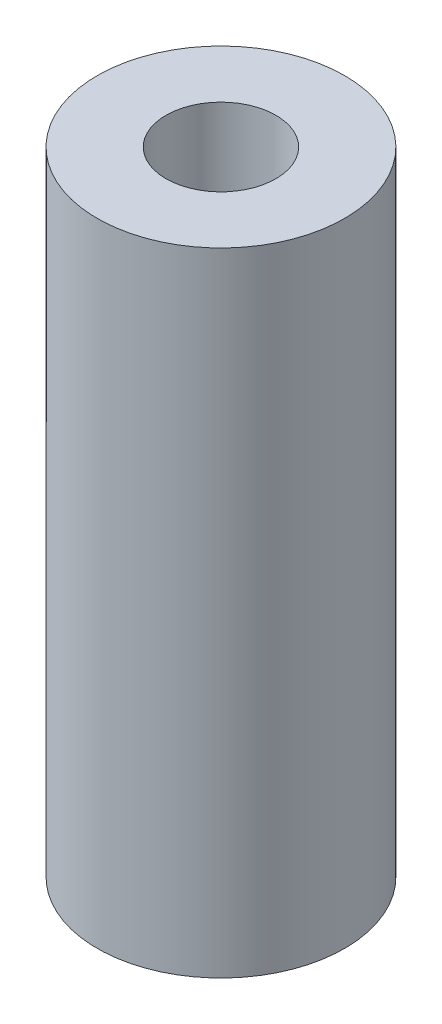
ISO-10303-21;
HEADER;
FILE_DESCRIPTION(('STEP AP214'),'2;1');
FILE_NAME('part.step','',(''),(''),'','','');
FILE_SCHEMA(('AUTOMOTIVE_DESIGN { 1 0 10303 214 1 1 1 1 }'));
ENDSEC;
DATA;
#1=APPLICATION_CONTEXT('core data for automotive mechanical design processes');
#2=APPLICATION_PROTOCOL_DEFINITION('international standard','automotive_design',2000,#1);
#3=PRODUCT_CONTEXT('',#1,'mechanical');
#4=PRODUCT('Part','Part','',(#3));
#5=PRODUCT_RELATED_PRODUCT_CATEGORY('part','',(#4));
#6=PRODUCT_DEFINITION_FORMATION('','',#4);
#7=PRODUCT_DEFINITION_CONTEXT('part definition',#1,'design');
#8=PRODUCT_DEFINITION('design','',#6,#7);
#9=PRODUCT_DEFINITION_SHAPE('','',#8);
#10=(LENGTH_UNIT() NAMED_UNIT(*) SI_UNIT(.MILLI.,.METRE.));
#11=(NAMED_UNIT(*) PLANE_ANGLE_UNIT() SI_UNIT($,.RADIAN.));
#12=(NAMED_UNIT(*) SI_UNIT($,.STERADIAN.) SOLID_ANGLE_UNIT());
#13=UNCERTAINTY_MEASURE_WITH_UNIT(LENGTH_MEASURE(1.E-05),#10,'distance_accuracy_value','');
#14=(GEOMETRIC_REPRESENTATION_CONTEXT(3) GLOBAL_UNCERTAINTY_ASSIGNED_CONTEXT((#13)) GLOBAL_UNIT_ASSIGNED_CONTEXT((#10,
#11,#12)) REPRESENTATION_CONTEXT('',''));
#15=CARTESIAN_POINT('',(0.,0.,0.));
#16=DIRECTION('',(0.,0.,1.));
#17=DIRECTION('',(1.,0.,0.));
#18=AXIS2_PLACEMENT_3D('',#15,#16,#17);
#19=CARTESIAN_POINT('',(0.,0.,0.));
#20=DIRECTION('',(0.,1.,0.));
#21=DIRECTION('',(0.,0.,1.));
#22=AXIS2_PLACEMENT_3D('',#19,#20,#21);
#23=PLANE('',#22);
#24=CARTESIAN_POINT('',(0.,0.,0.));
#25=DIRECTION('',(0.,-1.,0.));
#26=DIRECTION('',(0.,0.,-1.));
#27=AXIS2_PLACEMENT_3D('',#24,#25,#26);
#28=CIRCLE('',#27,1.5);
#29=CARTESIAN_POINT('',(0.,0.,-1.5));
#30=VERTEX_POINT('',#29);
#31=EDGE_CURVE('E43',#30,#30,#28,.T.);
#32=ORIENTED_EDGE('',*,*,#31,.F.);
#33=EDGE_LOOP('',(#32));
#34=FACE_BOUND('',#33,.T.);
#35=CARTESIAN_POINT('',(0.,0.,0.));
#36=DIRECTION('',(0.,-1.,0.));
#37=DIRECTION('',(0.,0.,-1.));
#38=AXIS2_PLACEMENT_3D('',#35,#36,#37);
#39=CIRCLE('',#38,4.5);
#40=CARTESIAN_POINT('',(0.,0.,-4.5));
#41=VERTEX_POINT('',#40);
#42=EDGE_CURVE('E34',#41,#41,#39,.T.);
#43=ORIENTED_EDGE('',*,*,#42,.T.);
#44=EDGE_LOOP('',(#43));
#45=FACE_BOUND('',#44,.T.);
#46=ADVANCED_FACE('F31',(#34,#45),#23,.F.);
#47=CARTESIAN_POINT('',(0.,23.,0.));
#48=DIRECTION('',(0.,-1.,0.));
#49=DIRECTION('',(0.,0.,-1.));
#50=AXIS2_PLACEMENT_3D('',#47,#48,#49);
#51=CYLINDRICAL_SURFACE('',#50,4.5);
#52=CARTESIAN_POINT('',(0.,23.,0.));
#53=DIRECTION('',(0.,-1.,0.));
#54=DIRECTION('',(0.,0.,-1.));
#55=AXIS2_PLACEMENT_3D('',#52,#53,#54);
#56=CIRCLE('',#55,4.5);
#57=CARTESIAN_POINT('',(0.,23.,-4.5));
#58=VERTEX_POINT('',#57);
#59=EDGE_CURVE('E10',#58,#58,#56,.T.);
#60=ORIENTED_EDGE('',*,*,#59,.T.);
#61=EDGE_LOOP('',(#60));
#62=FACE_BOUND('',#61,.T.);
#63=ORIENTED_EDGE('',*,*,#42,.F.);
#64=EDGE_LOOP('',(#63));
#65=FACE_BOUND('',#64,.T.);
#66=ADVANCED_FACE('F68',(#62,#65),#51,.T.);
#67=CARTESIAN_POINT('',(0.,23.,0.));
#68=DIRECTION('',(0.,1.,0.));
#69=DIRECTION('',(0.,0.,1.));
#70=AXIS2_PLACEMENT_3D('',#67,#68,#69);
#71=PLANE('',#70);
#72=CARTESIAN_POINT('',(0.,23.,0.));
#73=DIRECTION('',(0.,1.,0.));
#74=DIRECTION('',(0.,0.,1.));
#75=AXIS2_PLACEMENT_3D('',#72,#73,#74);
#76=CIRCLE('',#75,2.);
#77=CARTESIAN_POINT('',(0.,23.,2.));
#78=VERTEX_POINT('',#77);
#79=EDGE_CURVE('E49',#78,#78,#76,.T.);
#80=ORIENTED_EDGE('',*,*,#79,.F.);
#81=EDGE_LOOP('',(#80));
#82=FACE_BOUND('',#81,.T.);
#83=ORIENTED_EDGE('',*,*,#59,.F.);
#84=EDGE_LOOP('',(#83));
#85=FACE_BOUND('',#84,.T.);
#86=ADVANCED_FACE('F64',(#82,#85),#71,.T.);
#87=CARTESIAN_POINT('',(0.,5.,0.));
#88=DIRECTION('',(0.,-1.,0.));
#89=DIRECTION('',(0.,0.,-1.));
#90=AXIS2_PLACEMENT_3D('',#87,#88,#89);
#91=CYLINDRICAL_SURFACE('',#90,1.5);
#92=CARTESIAN_POINT('',(0.,5.,0.));
#93=DIRECTION('',(0.,-1.,0.));
#94=DIRECTION('',(0.,0.,-1.));
#95=AXIS2_PLACEMENT_3D('',#92,#93,#94);
#96=CIRCLE('',#95,1.5);
#97=CARTESIAN_POINT('',(0.,5.,-1.5));
#98=VERTEX_POINT('',#97);
#99=EDGE_CURVE('E41',#98,#98,#96,.T.);
#100=ORIENTED_EDGE('',*,*,#99,.F.);
#101=EDGE_LOOP('',(#100));
#102=FACE_BOUND('',#101,.T.);
#103=ORIENTED_EDGE('',*,*,#31,.T.);
#104=EDGE_LOOP('',(#103));
#105=FACE_BOUND('',#104,.T.);
#106=ADVANCED_FACE('F67',(#102,#105),#91,.F.);
#107=CARTESIAN_POINT('',(0.,5.,0.));
#108=DIRECTION('',(0.,-1.,0.));
#109=DIRECTION('',(0.,0.,-1.));
#110=AXIS2_PLACEMENT_3D('',#107,#108,#109);
#111=PLANE('',#110);
#112=ORIENTED_EDGE('',*,*,#99,.T.);
#113=EDGE_LOOP('',(#112));
#114=FACE_BOUND('',#113,.T.);
#115=ADVANCED_FACE('F60',(#114),#111,.T.);
#116=CARTESIAN_POINT('',(0.,18.,0.));
#117=DIRECTION('',(0.,1.,0.));
#118=DIRECTION('',(0.,0.,1.));
#119=AXIS2_PLACEMENT_3D('',#116,#117,#118);
#120=CYLINDRICAL_SURFACE('',#119,2.);
#121=CARTESIAN_POINT('',(0.,18.,0.));
#122=DIRECTION('',(0.,1.,0.));
#123=DIRECTION('',(0.,0.,1.));
#124=AXIS2_PLACEMENT_3D('',#121,#122,#123);
#125=CIRCLE('',#124,2.);
#126=CARTESIAN_POINT('',(0.,18.,2.));
#127=VERTEX_POINT('',#126);
#128=EDGE_CURVE('E46',#127,#127,#125,.T.);
#129=ORIENTED_EDGE('',*,*,#128,.F.);
#130=EDGE_LOOP('',(#129));
#131=FACE_BOUND('',#130,.T.);
#132=ORIENTED_EDGE('',*,*,#79,.T.);
#133=EDGE_LOOP('',(#132));
#134=FACE_BOUND('',#133,.T.);
#135=ADVANCED_FACE('F57',(#131,#134),#120,.F.);
#136=CARTESIAN_POINT('',(0.,18.,0.));
#137=DIRECTION('',(0.,1.,0.));
#138=DIRECTION('',(0.,0.,1.));
#139=AXIS2_PLACEMENT_3D('',#136,#137,#138);
#140=PLANE('',#139);
#141=ORIENTED_EDGE('',*,*,#128,.T.);
#142=EDGE_LOOP('',(#141));
#143=FACE_BOUND('',#142,.T.);
#144=ADVANCED_FACE('F55',(#143),#140,.T.);
#145=CLOSED_SHELL('',(#46,#66,#86,#106,#115,#135,#144));
#146=MANIFOLD_SOLID_BREP('B2',#145);
#147=ADVANCED_BREP_SHAPE_REPRESENTATION('',(#18,#146),#14);
#148=SHAPE_DEFINITION_REPRESENTATION(#9,#147);
ENDSEC;
END-ISO-10303-21;
